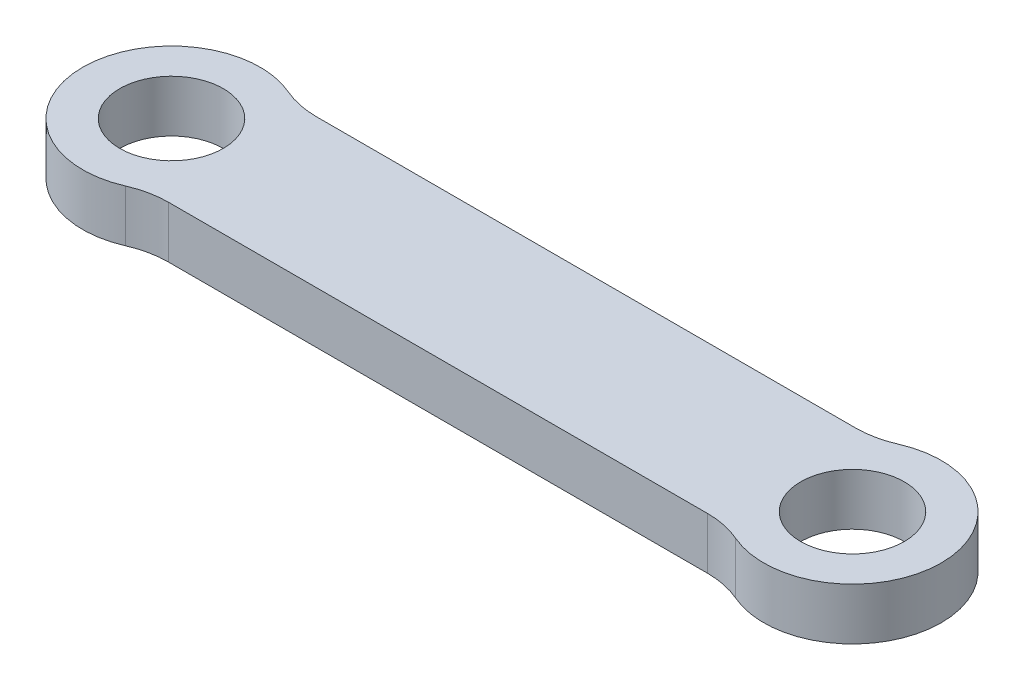
ISO-10303-21;
HEADER;
FILE_DESCRIPTION(('STEP AP214'),'2;1');
FILE_NAME('part.step','',(''),(''),'','','');
FILE_SCHEMA(('AUTOMOTIVE_DESIGN { 1 0 10303 214 1 1 1 1 }'));
ENDSEC;
DATA;
#1=APPLICATION_CONTEXT('core data for automotive mechanical design processes');
#2=APPLICATION_PROTOCOL_DEFINITION('international standard','automotive_design',2000,#1);
#3=PRODUCT_CONTEXT('',#1,'mechanical');
#4=PRODUCT('Part','Part','',(#3));
#5=PRODUCT_RELATED_PRODUCT_CATEGORY('part','',(#4));
#6=PRODUCT_DEFINITION_FORMATION('','',#4);
#7=PRODUCT_DEFINITION_CONTEXT('part definition',#1,'design');
#8=PRODUCT_DEFINITION('design','',#6,#7);
#9=PRODUCT_DEFINITION_SHAPE('','',#8);
#10=(LENGTH_UNIT() NAMED_UNIT(*) SI_UNIT(.MILLI.,.METRE.));
#11=(NAMED_UNIT(*) PLANE_ANGLE_UNIT() SI_UNIT($,.RADIAN.));
#12=(NAMED_UNIT(*) SI_UNIT($,.STERADIAN.) SOLID_ANGLE_UNIT());
#13=UNCERTAINTY_MEASURE_WITH_UNIT(LENGTH_MEASURE(1.E-05),#10,'distance_accuracy_value','');
#14=(GEOMETRIC_REPRESENTATION_CONTEXT(3) GLOBAL_UNCERTAINTY_ASSIGNED_CONTEXT((#13)) GLOBAL_UNIT_ASSIGNED_CONTEXT((#10,
#11,#12)) REPRESENTATION_CONTEXT('',''));
#15=CARTESIAN_POINT('',(0.,0.,0.));
#16=DIRECTION('',(0.,0.,1.));
#17=DIRECTION('',(1.,0.,0.));
#18=AXIS2_PLACEMENT_3D('',#15,#16,#17);
#19=CARTESIAN_POINT('',(23.,1.75,0.));
#20=DIRECTION('',(0.,-1.,0.));
#21=DIRECTION('',(0.,0.,-1.));
#22=AXIS2_PLACEMENT_3D('',#19,#20,#21);
#23=CYLINDRICAL_SURFACE('',#22,3.);
#24=CARTESIAN_POINT('',(23.,1.75,0.));
#25=DIRECTION('',(0.,1.,0.));
#26=DIRECTION('',(0.,0.,1.));
#27=AXIS2_PLACEMENT_3D('',#24,#25,#26);
#28=CIRCLE('',#27,3.);
#29=CARTESIAN_POINT('',(21.8010421191718,1.75,2.75));
#30=VERTEX_POINT('',#29);
#31=CARTESIAN_POINT('',(21.8010421191718,1.75,-2.75));
#32=VERTEX_POINT('',#31);
#33=EDGE_CURVE('E143',#30,#32,#28,.T.);
#34=ORIENTED_EDGE('',*,*,#33,.F.);
#35=DIRECTION('',(0.,-1.,0.));
#36=VECTOR('',#35,1.);
#37=CARTESIAN_POINT('',(21.8010421191718,1.75,2.75));
#38=LINE('',#37,#36);
#39=CARTESIAN_POINT('',(21.8010421191718,0.,2.75));
#40=VERTEX_POINT('',#39);
#41=EDGE_CURVE('E151',#30,#40,#38,.T.);
#42=ORIENTED_EDGE('',*,*,#41,.T.);
#43=CARTESIAN_POINT('',(23.,0.,0.));
#44=DIRECTION('',(0.,1.,0.));
#45=DIRECTION('',(0.,0.,1.));
#46=AXIS2_PLACEMENT_3D('',#43,#44,#45);
#47=CIRCLE('',#46,3.);
#48=CARTESIAN_POINT('',(21.8010421191718,0.,-2.75));
#49=VERTEX_POINT('',#48);
#50=EDGE_CURVE('E168',#40,#49,#47,.T.);
#51=ORIENTED_EDGE('',*,*,#50,.T.);
#52=DIRECTION('',(0.,-1.,0.));
#53=VECTOR('',#52,1.);
#54=CARTESIAN_POINT('',(21.8010421191718,1.75,-2.75));
#55=LINE('',#54,#53);
#56=EDGE_CURVE('E149',#49,#32,#55,.F.);
#57=ORIENTED_EDGE('',*,*,#56,.T.);
#58=EDGE_LOOP('',(#34,#42,#51,#57));
#59=FACE_BOUND('',#58,.T.);
#60=ADVANCED_FACE('F37',(#59),#23,.T.);
#61=CARTESIAN_POINT('',(0.,1.75,-2.5));
#62=DIRECTION('',(0.,0.,-1.));
#63=DIRECTION('',(-1.,0.,0.));
#64=AXIS2_PLACEMENT_3D('',#61,#62,#63);
#65=PLANE('',#64);
#66=DIRECTION('',(1.,0.,0.));
#67=VECTOR('',#66,1.);
#68=CARTESIAN_POINT('',(0.,1.75,-2.5));
#69=LINE('',#68,#67);
#70=CARTESIAN_POINT('',(2.39791576165636,1.75,-2.5));
#71=VERTEX_POINT('',#70);
#72=CARTESIAN_POINT('',(20.6020842383436,1.75,-2.5));
#73=VERTEX_POINT('',#72);
#74=EDGE_CURVE('E175',#71,#73,#69,.T.);
#75=ORIENTED_EDGE('',*,*,#74,.T.);
#76=DIRECTION('',(0.,-1.,0.));
#77=VECTOR('',#76,1.);
#78=CARTESIAN_POINT('',(20.6020842383436,1.75,-2.5));
#79=LINE('',#78,#77);
#80=CARTESIAN_POINT('',(20.6020842383436,0.,-2.5));
#81=VERTEX_POINT('',#80);
#82=EDGE_CURVE('E114',#73,#81,#79,.T.);
#83=ORIENTED_EDGE('',*,*,#82,.T.);
#84=DIRECTION('',(1.,0.,0.));
#85=VECTOR('',#84,1.);
#86=CARTESIAN_POINT('',(0.,0.,-2.5));
#87=LINE('',#86,#85);
#88=CARTESIAN_POINT('',(2.39791576165636,0.,-2.5));
#89=VERTEX_POINT('',#88);
#90=EDGE_CURVE('E137',#89,#81,#87,.T.);
#91=ORIENTED_EDGE('',*,*,#90,.F.);
#92=DIRECTION('',(0.,-1.,0.));
#93=VECTOR('',#92,1.);
#94=CARTESIAN_POINT('',(2.39791576165636,1.75,-2.5));
#95=LINE('',#94,#93);
#96=EDGE_CURVE('E59',#89,#71,#95,.F.);
#97=ORIENTED_EDGE('',*,*,#96,.T.);
#98=EDGE_LOOP('',(#75,#83,#91,#97));
#99=FACE_BOUND('',#98,.T.);
#100=ADVANCED_FACE('F166',(#99),#65,.T.);
#101=CARTESIAN_POINT('',(0.,1.75,0.));
#102=DIRECTION('',(0.,-1.,0.));
#103=DIRECTION('',(0.,0.,-1.));
#104=AXIS2_PLACEMENT_3D('',#101,#102,#103);
#105=CYLINDRICAL_SURFACE('',#104,3.);
#106=CARTESIAN_POINT('',(0.,0.,0.));
#107=DIRECTION('',(0.,1.,0.));
#108=DIRECTION('',(0.,0.,1.));
#109=AXIS2_PLACEMENT_3D('',#106,#107,#108);
#110=CIRCLE('',#109,3.);
#111=CARTESIAN_POINT('',(1.19895788082818,0.,-2.75));
#112=VERTEX_POINT('',#111);
#113=CARTESIAN_POINT('',(1.19895788082818,0.,2.75));
#114=VERTEX_POINT('',#113);
#115=EDGE_CURVE('E132',#112,#114,#110,.T.);
#116=ORIENTED_EDGE('',*,*,#115,.T.);
#117=DIRECTION('',(0.,-1.,0.));
#118=VECTOR('',#117,1.);
#119=CARTESIAN_POINT('',(1.19895788082818,1.75,2.75));
#120=LINE('',#119,#118);
#121=CARTESIAN_POINT('',(1.19895788082818,1.75,2.75));
#122=VERTEX_POINT('',#121);
#123=EDGE_CURVE('E108',#114,#122,#120,.F.);
#124=ORIENTED_EDGE('',*,*,#123,.T.);
#125=CARTESIAN_POINT('',(0.,1.75,0.));
#126=DIRECTION('',(0.,1.,0.));
#127=DIRECTION('',(0.,0.,1.));
#128=AXIS2_PLACEMENT_3D('',#125,#126,#127);
#129=CIRCLE('',#128,3.);
#130=CARTESIAN_POINT('',(1.19895788082818,1.75,-2.75));
#131=VERTEX_POINT('',#130);
#132=EDGE_CURVE('E174',#131,#122,#129,.T.);
#133=ORIENTED_EDGE('',*,*,#132,.F.);
#134=DIRECTION('',(0.,-1.,0.));
#135=VECTOR('',#134,1.);
#136=CARTESIAN_POINT('',(1.19895788082818,1.75,-2.75));
#137=LINE('',#136,#135);
#138=EDGE_CURVE('E124',#131,#112,#137,.T.);
#139=ORIENTED_EDGE('',*,*,#138,.T.);
#140=EDGE_LOOP('',(#116,#124,#133,#139));
#141=FACE_BOUND('',#140,.T.);
#142=ADVANCED_FACE('F177',(#141),#105,.T.);
#143=CARTESIAN_POINT('',(0.,1.75,0.));
#144=DIRECTION('',(0.,-1.,0.));
#145=DIRECTION('',(0.,0.,-1.));
#146=AXIS2_PLACEMENT_3D('',#143,#144,#145);
#147=CYLINDRICAL_SURFACE('',#146,1.75);
#148=CARTESIAN_POINT('',(0.,1.75,0.));
#149=DIRECTION('',(0.,1.,0.));
#150=DIRECTION('',(0.,0.,1.));
#151=AXIS2_PLACEMENT_3D('',#148,#149,#150);
#152=CIRCLE('',#151,1.75);
#153=CARTESIAN_POINT('',(0.,1.75,1.75));
#154=VERTEX_POINT('',#153);
#155=EDGE_CURVE('E179',#154,#154,#152,.T.);
#156=ORIENTED_EDGE('',*,*,#155,.T.);
#157=EDGE_LOOP('',(#156));
#158=FACE_BOUND('',#157,.T.);
#159=CARTESIAN_POINT('',(0.,0.,0.));
#160=DIRECTION('',(0.,1.,0.));
#161=DIRECTION('',(0.,0.,1.));
#162=AXIS2_PLACEMENT_3D('',#159,#160,#161);
#163=CIRCLE('',#162,1.75);
#164=CARTESIAN_POINT('',(0.,0.,1.75));
#165=VERTEX_POINT('',#164);
#166=EDGE_CURVE('E131',#165,#165,#163,.T.);
#167=ORIENTED_EDGE('',*,*,#166,.F.);
#168=EDGE_LOOP('',(#167));
#169=FACE_BOUND('',#168,.T.);
#170=ADVANCED_FACE('F225',(#158,#169),#147,.F.);
#171=CARTESIAN_POINT('',(0.,1.75,2.5));
#172=DIRECTION('',(0.,0.,-1.));
#173=DIRECTION('',(-1.,0.,0.));
#174=AXIS2_PLACEMENT_3D('',#171,#172,#173);
#175=PLANE('',#174);
#176=DIRECTION('',(1.,0.,0.));
#177=VECTOR('',#176,1.);
#178=CARTESIAN_POINT('',(0.,1.75,2.5));
#179=LINE('',#178,#177);
#180=CARTESIAN_POINT('',(2.39791576165636,1.75,2.5));
#181=VERTEX_POINT('',#180);
#182=CARTESIAN_POINT('',(20.6020842383436,1.75,2.5));
#183=VERTEX_POINT('',#182);
#184=EDGE_CURVE('E123',#181,#183,#179,.T.);
#185=ORIENTED_EDGE('',*,*,#184,.F.);
#186=DIRECTION('',(0.,1.,0.));
#187=VECTOR('',#186,1.);
#188=CARTESIAN_POINT('',(2.39791576165636,0.,2.5));
#189=LINE('',#188,#187);
#190=CARTESIAN_POINT('',(2.39791576165636,0.,2.5));
#191=VERTEX_POINT('',#190);
#192=EDGE_CURVE('E107',#181,#191,#189,.F.);
#193=ORIENTED_EDGE('',*,*,#192,.T.);
#194=DIRECTION('',(1.,0.,0.));
#195=VECTOR('',#194,1.);
#196=CARTESIAN_POINT('',(0.,0.,2.5));
#197=LINE('',#196,#195);
#198=CARTESIAN_POINT('',(20.6020842383436,0.,2.5));
#199=VERTEX_POINT('',#198);
#200=EDGE_CURVE('E120',#191,#199,#197,.T.);
#201=ORIENTED_EDGE('',*,*,#200,.T.);
#202=DIRECTION('',(0.,1.,0.));
#203=VECTOR('',#202,1.);
#204=CARTESIAN_POINT('',(20.6020842383436,1.75,2.5));
#205=LINE('',#204,#203);
#206=EDGE_CURVE('E125',#199,#183,#205,.T.);
#207=ORIENTED_EDGE('',*,*,#206,.T.);
#208=EDGE_LOOP('',(#185,#193,#201,#207));
#209=FACE_BOUND('',#208,.T.);
#210=ADVANCED_FACE('F119',(#209),#175,.F.);
#211=CARTESIAN_POINT('',(23.,1.75,0.));
#212=DIRECTION('',(0.,-1.,0.));
#213=DIRECTION('',(0.,0.,-1.));
#214=AXIS2_PLACEMENT_3D('',#211,#212,#213);
#215=CYLINDRICAL_SURFACE('',#214,1.75);
#216=CARTESIAN_POINT('',(23.,1.75,0.));
#217=DIRECTION('',(0.,1.,0.));
#218=DIRECTION('',(0.,0.,1.));
#219=AXIS2_PLACEMENT_3D('',#216,#217,#218);
#220=CIRCLE('',#219,1.75);
#221=CARTESIAN_POINT('',(23.,1.75,1.75));
#222=VERTEX_POINT('',#221);
#223=EDGE_CURVE('E144',#222,#222,#220,.T.);
#224=ORIENTED_EDGE('',*,*,#223,.T.);
#225=EDGE_LOOP('',(#224));
#226=FACE_BOUND('',#225,.T.);
#227=CARTESIAN_POINT('',(23.,0.,0.));
#228=DIRECTION('',(0.,1.,0.));
#229=DIRECTION('',(0.,0.,1.));
#230=AXIS2_PLACEMENT_3D('',#227,#228,#229);
#231=CIRCLE('',#230,1.75);
#232=CARTESIAN_POINT('',(23.,0.,1.75));
#233=VERTEX_POINT('',#232);
#234=EDGE_CURVE('E135',#233,#233,#231,.T.);
#235=ORIENTED_EDGE('',*,*,#234,.F.);
#236=EDGE_LOOP('',(#235));
#237=FACE_BOUND('',#236,.T.);
#238=ADVANCED_FACE('F219',(#226,#237),#215,.F.);
#239=CARTESIAN_POINT('',(0.,1.75,0.));
#240=DIRECTION('',(0.,1.,0.));
#241=DIRECTION('',(0.,0.,1.));
#242=AXIS2_PLACEMENT_3D('',#239,#240,#241);
#243=PLANE('',#242);
#244=ORIENTED_EDGE('',*,*,#184,.T.);
#245=CARTESIAN_POINT('',(20.6020842383436,1.75,5.5));
#246=DIRECTION('',(0.,1.,0.));
#247=DIRECTION('',(0.,0.,1.));
#248=AXIS2_PLACEMENT_3D('',#245,#246,#247);
#249=CIRCLE('',#248,3.);
#250=EDGE_CURVE('E159',#183,#30,#249,.F.);
#251=ORIENTED_EDGE('',*,*,#250,.T.);
#252=ORIENTED_EDGE('',*,*,#33,.T.);
#253=CARTESIAN_POINT('',(20.6020842383436,1.75,-5.5));
#254=DIRECTION('',(0.,1.,0.));
#255=DIRECTION('',(0.,0.,1.));
#256=AXIS2_PLACEMENT_3D('',#253,#254,#255);
#257=CIRCLE('',#256,3.);
#258=EDGE_CURVE('E52',#32,#73,#257,.F.);
#259=ORIENTED_EDGE('',*,*,#258,.T.);
#260=ORIENTED_EDGE('',*,*,#74,.F.);
#261=CARTESIAN_POINT('',(2.39791576165636,1.75,-5.5));
#262=DIRECTION('',(0.,1.,0.));
#263=DIRECTION('',(0.,0.,1.));
#264=AXIS2_PLACEMENT_3D('',#261,#262,#263);
#265=CIRCLE('',#264,3.);
#266=EDGE_CURVE('E11',#71,#131,#265,.F.);
#267=ORIENTED_EDGE('',*,*,#266,.T.);
#268=ORIENTED_EDGE('',*,*,#132,.T.);
#269=CARTESIAN_POINT('',(2.39791576165636,1.75,5.5));
#270=DIRECTION('',(0.,1.,0.));
#271=DIRECTION('',(0.,0.,1.));
#272=AXIS2_PLACEMENT_3D('',#269,#270,#271);
#273=CIRCLE('',#272,3.);
#274=EDGE_CURVE('E113',#122,#181,#273,.F.);
#275=ORIENTED_EDGE('',*,*,#274,.T.);
#276=EDGE_LOOP('',(#244,#251,#252,#259,#260,#267,#268,#275));
#277=FACE_BOUND('',#276,.T.);
#278=ORIENTED_EDGE('',*,*,#155,.F.);
#279=EDGE_LOOP('',(#278));
#280=FACE_BOUND('',#279,.T.);
#281=ORIENTED_EDGE('',*,*,#223,.F.);
#282=EDGE_LOOP('',(#281));
#283=FACE_BOUND('',#282,.T.);
#284=ADVANCED_FACE('F172',(#277,#280,#283),#243,.T.);
#285=CARTESIAN_POINT('',(0.,0.,0.));
#286=DIRECTION('',(0.,1.,0.));
#287=DIRECTION('',(0.,0.,1.));
#288=AXIS2_PLACEMENT_3D('',#285,#286,#287);
#289=PLANE('',#288);
#290=ORIENTED_EDGE('',*,*,#50,.F.);
#291=CARTESIAN_POINT('',(20.6020842383436,0.,5.5));
#292=DIRECTION('',(0.,1.,0.));
#293=DIRECTION('',(0.,0.,1.));
#294=AXIS2_PLACEMENT_3D('',#291,#292,#293);
#295=CIRCLE('',#294,3.);
#296=EDGE_CURVE('E130',#40,#199,#295,.T.);
#297=ORIENTED_EDGE('',*,*,#296,.T.);
#298=ORIENTED_EDGE('',*,*,#200,.F.);
#299=CARTESIAN_POINT('',(2.39791576165636,0.,5.5));
#300=DIRECTION('',(0.,1.,0.));
#301=DIRECTION('',(0.,0.,1.));
#302=AXIS2_PLACEMENT_3D('',#299,#300,#301);
#303=CIRCLE('',#302,3.);
#304=EDGE_CURVE('E103',#191,#114,#303,.T.);
#305=ORIENTED_EDGE('',*,*,#304,.T.);
#306=ORIENTED_EDGE('',*,*,#115,.F.);
#307=CARTESIAN_POINT('',(2.39791576165636,0.,-5.5));
#308=DIRECTION('',(0.,1.,0.));
#309=DIRECTION('',(0.,0.,1.));
#310=AXIS2_PLACEMENT_3D('',#307,#308,#309);
#311=CIRCLE('',#310,3.);
#312=EDGE_CURVE('E45',#112,#89,#311,.T.);
#313=ORIENTED_EDGE('',*,*,#312,.T.);
#314=ORIENTED_EDGE('',*,*,#90,.T.);
#315=CARTESIAN_POINT('',(20.6020842383436,0.,-5.5));
#316=DIRECTION('',(0.,1.,0.));
#317=DIRECTION('',(0.,0.,1.));
#318=AXIS2_PLACEMENT_3D('',#315,#316,#317);
#319=CIRCLE('',#318,3.);
#320=EDGE_CURVE('E161',#81,#49,#319,.T.);
#321=ORIENTED_EDGE('',*,*,#320,.T.);
#322=EDGE_LOOP('',(#290,#297,#298,#305,#306,#313,#314,#321));
#323=FACE_BOUND('',#322,.T.);
#324=ORIENTED_EDGE('',*,*,#166,.T.);
#325=EDGE_LOOP('',(#324));
#326=FACE_BOUND('',#325,.T.);
#327=ORIENTED_EDGE('',*,*,#234,.T.);
#328=EDGE_LOOP('',(#327));
#329=FACE_BOUND('',#328,.T.);
#330=ADVANCED_FACE('F128',(#323,#326,#329),#289,.F.);
#331=CARTESIAN_POINT('',(2.39791576165636,1.75,5.5));
#332=DIRECTION('',(0.,-1.,0.));
#333=DIRECTION('',(0.,0.,-1.));
#334=AXIS2_PLACEMENT_3D('',#331,#332,#333);
#335=CYLINDRICAL_SURFACE('',#334,3.);
#336=ORIENTED_EDGE('',*,*,#274,.F.);
#337=ORIENTED_EDGE('',*,*,#123,.F.);
#338=ORIENTED_EDGE('',*,*,#304,.F.);
#339=ORIENTED_EDGE('',*,*,#192,.F.);
#340=EDGE_LOOP('',(#336,#337,#338,#339));
#341=FACE_BOUND('',#340,.T.);
#342=ADVANCED_FACE('F106',(#341),#335,.F.);
#343=CARTESIAN_POINT('',(20.6020842383436,1.75,5.5));
#344=DIRECTION('',(0.,-1.,0.));
#345=DIRECTION('',(0.,0.,-1.));
#346=AXIS2_PLACEMENT_3D('',#343,#344,#345);
#347=CYLINDRICAL_SURFACE('',#346,3.);
#348=ORIENTED_EDGE('',*,*,#250,.F.);
#349=ORIENTED_EDGE('',*,*,#206,.F.);
#350=ORIENTED_EDGE('',*,*,#296,.F.);
#351=ORIENTED_EDGE('',*,*,#41,.F.);
#352=EDGE_LOOP('',(#348,#349,#350,#351));
#353=FACE_BOUND('',#352,.T.);
#354=ADVANCED_FACE('F196',(#353),#347,.F.);
#355=CARTESIAN_POINT('',(20.6020842383436,1.75,-5.5));
#356=DIRECTION('',(0.,-1.,0.));
#357=DIRECTION('',(0.,0.,-1.));
#358=AXIS2_PLACEMENT_3D('',#355,#356,#357);
#359=CYLINDRICAL_SURFACE('',#358,3.);
#360=ORIENTED_EDGE('',*,*,#258,.F.);
#361=ORIENTED_EDGE('',*,*,#56,.F.);
#362=ORIENTED_EDGE('',*,*,#320,.F.);
#363=ORIENTED_EDGE('',*,*,#82,.F.);
#364=EDGE_LOOP('',(#360,#361,#362,#363));
#365=FACE_BOUND('',#364,.T.);
#366=ADVANCED_FACE('F194',(#365),#359,.F.);
#367=CARTESIAN_POINT('',(2.39791576165636,1.75,-5.5));
#368=DIRECTION('',(0.,-1.,0.));
#369=DIRECTION('',(0.,0.,-1.));
#370=AXIS2_PLACEMENT_3D('',#367,#368,#369);
#371=CYLINDRICAL_SURFACE('',#370,3.);
#372=ORIENTED_EDGE('',*,*,#266,.F.);
#373=ORIENTED_EDGE('',*,*,#96,.F.);
#374=ORIENTED_EDGE('',*,*,#312,.F.);
#375=ORIENTED_EDGE('',*,*,#138,.F.);
#376=EDGE_LOOP('',(#372,#373,#374,#375));
#377=FACE_BOUND('',#376,.T.);
#378=ADVANCED_FACE('F39',(#377),#371,.F.);
#379=CLOSED_SHELL('',(#60,#100,#142,#170,#210,#238,#284,#330,#342,#354,#366,#378));
#380=MANIFOLD_SOLID_BREP('B2',#379);
#381=ADVANCED_BREP_SHAPE_REPRESENTATION('',(#18,#380),#14);
#382=SHAPE_DEFINITION_REPRESENTATION(#9,#381);
ENDSEC;
END-ISO-10303-21;
